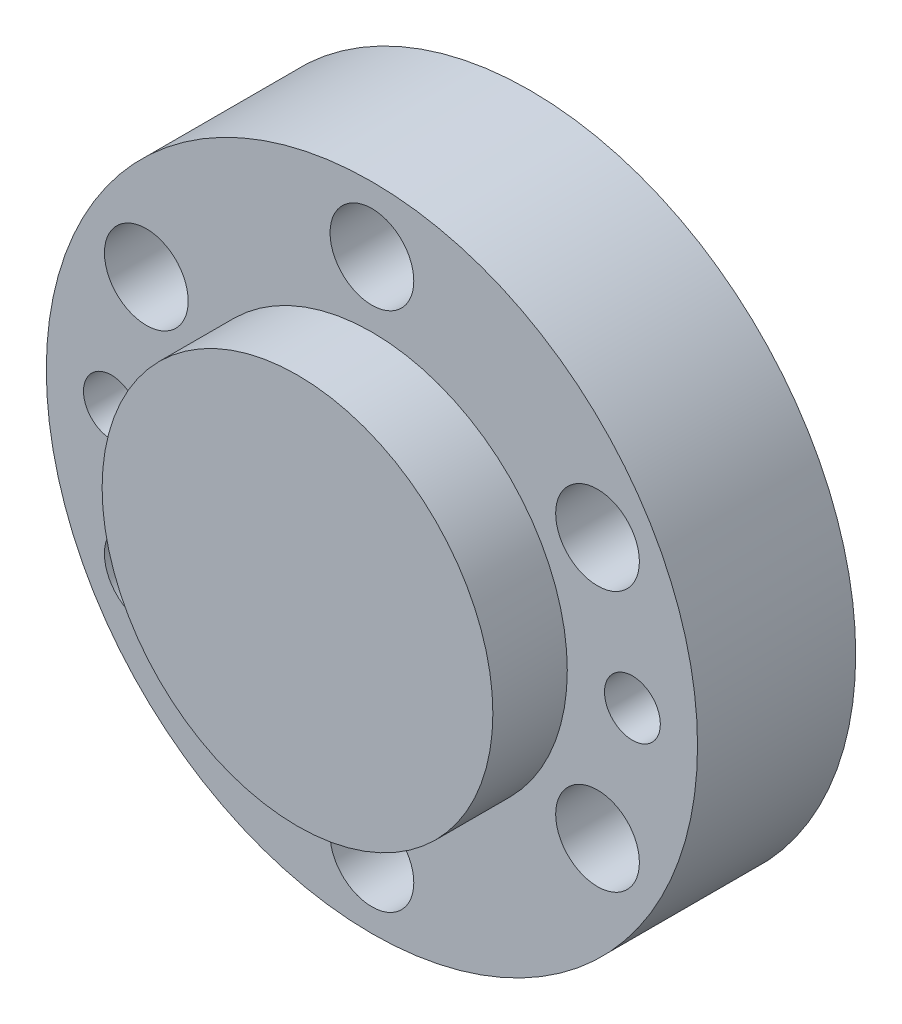
ISO-10303-21;
HEADER;
FILE_DESCRIPTION(('STEP AP214'),'2;1');
FILE_NAME('part.step','',(''),(''),'','','');
FILE_SCHEMA(('AUTOMOTIVE_DESIGN { 1 0 10303 214 1 1 1 1 }'));
ENDSEC;
DATA;
#1=APPLICATION_CONTEXT('core data for automotive mechanical design processes');
#2=APPLICATION_PROTOCOL_DEFINITION('international standard','automotive_design',2000,#1);
#3=PRODUCT_CONTEXT('',#1,'mechanical');
#4=PRODUCT('Part','Part','',(#3));
#5=PRODUCT_RELATED_PRODUCT_CATEGORY('part','',(#4));
#6=PRODUCT_DEFINITION_FORMATION('','',#4);
#7=PRODUCT_DEFINITION_CONTEXT('part definition',#1,'design');
#8=PRODUCT_DEFINITION('design','',#6,#7);
#9=PRODUCT_DEFINITION_SHAPE('','',#8);
#10=(LENGTH_UNIT() NAMED_UNIT(*) SI_UNIT(.MILLI.,.METRE.));
#11=(NAMED_UNIT(*) PLANE_ANGLE_UNIT() SI_UNIT($,.RADIAN.));
#12=(NAMED_UNIT(*) SI_UNIT($,.STERADIAN.) SOLID_ANGLE_UNIT());
#13=UNCERTAINTY_MEASURE_WITH_UNIT(LENGTH_MEASURE(1.E-05),#10,'distance_accuracy_value','');
#14=(GEOMETRIC_REPRESENTATION_CONTEXT(3) GLOBAL_UNCERTAINTY_ASSIGNED_CONTEXT((#13)) GLOBAL_UNIT_ASSIGNED_CONTEXT((#10,
#11,#12)) REPRESENTATION_CONTEXT('',''));
#15=CARTESIAN_POINT('',(0.,0.,0.));
#16=DIRECTION('',(0.,0.,1.));
#17=DIRECTION('',(1.,0.,0.));
#18=AXIS2_PLACEMENT_3D('',#15,#16,#17);
#19=CARTESIAN_POINT('',(0.,0.,-8.5));
#20=DIRECTION('',(0.,0.,-1.));
#21=DIRECTION('',(-1.,0.,0.));
#22=AXIS2_PLACEMENT_3D('',#19,#20,#21);
#23=PLANE('',#22);
#24=CARTESIAN_POINT('',(12.1243556529818,6.99999999999949,-8.5));
#25=DIRECTION('',(0.,0.,-1.));
#26=DIRECTION('',(-1.,0.,0.));
#27=AXIS2_PLACEMENT_3D('',#24,#25,#26);
#28=CIRCLE('',#27,2.25);
#29=CARTESIAN_POINT('',(9.87435565298185,6.99999999999949,-8.5));
#30=VERTEX_POINT('',#29);
#31=EDGE_CURVE('E65',#30,#30,#28,.T.);
#32=ORIENTED_EDGE('',*,*,#31,.F.);
#33=EDGE_LOOP('',(#32));
#34=FACE_BOUND('',#33,.T.);
#35=CARTESIAN_POINT('',(12.1243556529812,-7.00000000000052,-8.5));
#36=DIRECTION('',(0.,0.,-1.));
#37=DIRECTION('',(-1.,0.,0.));
#38=AXIS2_PLACEMENT_3D('',#35,#36,#37);
#39=CIRCLE('',#38,2.25);
#40=CARTESIAN_POINT('',(9.87435565298125,-7.00000000000052,-8.5));
#41=VERTEX_POINT('',#40);
#42=EDGE_CURVE('E70',#41,#41,#39,.T.);
#43=ORIENTED_EDGE('',*,*,#42,.F.);
#44=EDGE_LOOP('',(#43));
#45=FACE_BOUND('',#44,.T.);
#46=CARTESIAN_POINT('',(-1.18856827952055E-12,-14.,-8.5));
#47=DIRECTION('',(0.,0.,-1.));
#48=DIRECTION('',(-1.,0.,0.));
#49=AXIS2_PLACEMENT_3D('',#46,#47,#48);
#50=CIRCLE('',#49,2.25);
#51=CARTESIAN_POINT('',(-2.25000000000119,-14.,-8.5));
#52=VERTEX_POINT('',#51);
#53=EDGE_CURVE('E75',#52,#52,#50,.T.);
#54=ORIENTED_EDGE('',*,*,#53,.F.);
#55=EDGE_LOOP('',(#54));
#56=FACE_BOUND('',#55,.T.);
#57=CARTESIAN_POINT('',(-12.124355652983,-6.99999999999948,-8.5));
#58=DIRECTION('',(0.,0.,-1.));
#59=DIRECTION('',(-1.,0.,0.));
#60=AXIS2_PLACEMENT_3D('',#57,#58,#59);
#61=CIRCLE('',#60,2.25);
#62=CARTESIAN_POINT('',(-14.374355652983,-6.99999999999948,-8.5));
#63=VERTEX_POINT('',#62);
#64=EDGE_CURVE('E80',#63,#63,#61,.T.);
#65=ORIENTED_EDGE('',*,*,#64,.F.);
#66=EDGE_LOOP('',(#65));
#67=FACE_BOUND('',#66,.T.);
#68=CARTESIAN_POINT('',(-12.1243556529824,7.00000000000052,-8.5));
#69=DIRECTION('',(0.,0.,-1.));
#70=DIRECTION('',(-1.,0.,0.));
#71=AXIS2_PLACEMENT_3D('',#68,#69,#70);
#72=CIRCLE('',#71,2.25);
#73=CARTESIAN_POINT('',(-14.3743556529824,7.00000000000052,-8.5));
#74=VERTEX_POINT('',#73);
#75=EDGE_CURVE('E84',#74,#74,#72,.T.);
#76=ORIENTED_EDGE('',*,*,#75,.F.);
#77=EDGE_LOOP('',(#76));
#78=FACE_BOUND('',#77,.T.);
#79=CARTESIAN_POINT('',(0.,14.,-8.5));
#80=DIRECTION('',(0.,0.,-1.));
#81=DIRECTION('',(-1.,0.,0.));
#82=AXIS2_PLACEMENT_3D('',#79,#80,#81);
#83=CIRCLE('',#82,2.25);
#84=CARTESIAN_POINT('',(-2.25,14.,-8.5));
#85=VERTEX_POINT('',#84);
#86=EDGE_CURVE('E88',#85,#85,#83,.T.);
#87=ORIENTED_EDGE('',*,*,#86,.F.);
#88=EDGE_LOOP('',(#87));
#89=FACE_BOUND('',#88,.T.);
#90=CARTESIAN_POINT('',(-14.,0.,-8.5));
#91=DIRECTION('',(0.,0.,-1.));
#92=DIRECTION('',(-1.,0.,0.));
#93=AXIS2_PLACEMENT_3D('',#90,#91,#92);
#94=CIRCLE('',#93,1.5);
#95=CARTESIAN_POINT('',(-15.5,0.,-8.5));
#96=VERTEX_POINT('',#95);
#97=EDGE_CURVE('E102',#96,#96,#94,.T.);
#98=ORIENTED_EDGE('',*,*,#97,.F.);
#99=EDGE_LOOP('',(#98));
#100=FACE_BOUND('',#99,.T.);
#101=CARTESIAN_POINT('',(14.,0.,-8.5));
#102=DIRECTION('',(0.,0.,-1.));
#103=DIRECTION('',(-1.,0.,0.));
#104=AXIS2_PLACEMENT_3D('',#101,#102,#103);
#105=CIRCLE('',#104,1.5);
#106=CARTESIAN_POINT('',(12.5,0.,-8.5));
#107=VERTEX_POINT('',#106);
#108=EDGE_CURVE('E138',#107,#107,#105,.T.);
#109=ORIENTED_EDGE('',*,*,#108,.F.);
#110=EDGE_LOOP('',(#109));
#111=FACE_BOUND('',#110,.T.);
#112=CARTESIAN_POINT('',(0.,0.,-8.5));
#113=DIRECTION('',(0.,0.,1.));
#114=DIRECTION('',(1.,0.,0.));
#115=AXIS2_PLACEMENT_3D('',#112,#113,#114);
#116=CIRCLE('',#115,17.5);
#117=CARTESIAN_POINT('',(17.5,0.,-8.5));
#118=VERTEX_POINT('',#117);
#119=EDGE_CURVE('E141',#118,#118,#116,.T.);
#120=ORIENTED_EDGE('',*,*,#119,.F.);
#121=EDGE_LOOP('',(#120));
#122=FACE_BOUND('',#121,.T.);
#123=ADVANCED_FACE('F44',(#34,#45,#56,#67,#78,#89,#100,#111,#122),#23,.T.);
#124=CARTESIAN_POINT('',(19.,0.,0.));
#125=DIRECTION('',(0.,0.,1.));
#126=DIRECTION('',(1.,0.,0.));
#127=AXIS2_PLACEMENT_3D('',#124,#125,#126);
#128=PLANE('',#127);
#129=CARTESIAN_POINT('',(0.,0.,0.));
#130=DIRECTION('',(0.,0.,1.));
#131=DIRECTION('',(1.,0.,0.));
#132=AXIS2_PLACEMENT_3D('',#129,#130,#131);
#133=CIRCLE('',#132,10.5);
#134=CARTESIAN_POINT('',(10.5,0.,0.));
#135=VERTEX_POINT('',#134);
#136=EDGE_CURVE('E10',#135,#135,#133,.T.);
#137=ORIENTED_EDGE('',*,*,#136,.F.);
#138=EDGE_LOOP('',(#137));
#139=FACE_BOUND('',#138,.T.);
#140=CARTESIAN_POINT('',(12.1243556529818,6.99999999999949,0.));
#141=DIRECTION('',(0.,0.,1.));
#142=DIRECTION('',(1.,0.,0.));
#143=AXIS2_PLACEMENT_3D('',#140,#141,#142);
#144=CIRCLE('',#143,2.25);
#145=CARTESIAN_POINT('',(14.3743556529818,6.99999999999949,0.));
#146=VERTEX_POINT('',#145);
#147=EDGE_CURVE('E58',#146,#146,#144,.T.);
#148=ORIENTED_EDGE('',*,*,#147,.F.);
#149=EDGE_LOOP('',(#148));
#150=FACE_BOUND('',#149,.T.);
#151=CARTESIAN_POINT('',(12.1243556529812,-7.00000000000052,0.));
#152=DIRECTION('',(0.,0.,1.));
#153=DIRECTION('',(1.,0.,0.));
#154=AXIS2_PLACEMENT_3D('',#151,#152,#153);
#155=CIRCLE('',#154,2.25);
#156=CARTESIAN_POINT('',(14.3743556529812,-7.00000000000052,0.));
#157=VERTEX_POINT('',#156);
#158=EDGE_CURVE('E66',#157,#157,#155,.T.);
#159=ORIENTED_EDGE('',*,*,#158,.F.);
#160=EDGE_LOOP('',(#159));
#161=FACE_BOUND('',#160,.T.);
#162=CARTESIAN_POINT('',(-1.18856827952055E-12,-14.,0.));
#163=DIRECTION('',(0.,0.,1.));
#164=DIRECTION('',(1.,0.,0.));
#165=AXIS2_PLACEMENT_3D('',#162,#163,#164);
#166=CIRCLE('',#165,2.25);
#167=CARTESIAN_POINT('',(2.24999999999881,-14.,0.));
#168=VERTEX_POINT('',#167);
#169=EDGE_CURVE('E71',#168,#168,#166,.T.);
#170=ORIENTED_EDGE('',*,*,#169,.F.);
#171=EDGE_LOOP('',(#170));
#172=FACE_BOUND('',#171,.T.);
#173=CARTESIAN_POINT('',(-12.124355652983,-6.99999999999948,0.));
#174=DIRECTION('',(0.,0.,1.));
#175=DIRECTION('',(1.,0.,0.));
#176=AXIS2_PLACEMENT_3D('',#173,#174,#175);
#177=CIRCLE('',#176,2.25);
#178=CARTESIAN_POINT('',(-9.87435565298304,-6.99999999999948,0.));
#179=VERTEX_POINT('',#178);
#180=EDGE_CURVE('E76',#179,#179,#177,.T.);
#181=ORIENTED_EDGE('',*,*,#180,.F.);
#182=EDGE_LOOP('',(#181));
#183=FACE_BOUND('',#182,.T.);
#184=CARTESIAN_POINT('',(-12.1243556529824,7.00000000000052,0.));
#185=DIRECTION('',(0.,0.,1.));
#186=DIRECTION('',(1.,0.,0.));
#187=AXIS2_PLACEMENT_3D('',#184,#185,#186);
#188=CIRCLE('',#187,2.25);
#189=CARTESIAN_POINT('',(-9.87435565298244,7.00000000000052,0.));
#190=VERTEX_POINT('',#189);
#191=EDGE_CURVE('E81',#190,#190,#188,.T.);
#192=ORIENTED_EDGE('',*,*,#191,.F.);
#193=EDGE_LOOP('',(#192));
#194=FACE_BOUND('',#193,.T.);
#195=CARTESIAN_POINT('',(0.,14.,0.));
#196=DIRECTION('',(0.,0.,1.));
#197=DIRECTION('',(1.,0.,0.));
#198=AXIS2_PLACEMENT_3D('',#195,#196,#197);
#199=CIRCLE('',#198,2.25);
#200=CARTESIAN_POINT('',(2.25,14.,0.));
#201=VERTEX_POINT('',#200);
#202=EDGE_CURVE('E85',#201,#201,#199,.T.);
#203=ORIENTED_EDGE('',*,*,#202,.F.);
#204=EDGE_LOOP('',(#203));
#205=FACE_BOUND('',#204,.T.);
#206=CARTESIAN_POINT('',(-14.,0.,0.));
#207=DIRECTION('',(0.,0.,1.));
#208=DIRECTION('',(1.,0.,0.));
#209=AXIS2_PLACEMENT_3D('',#206,#207,#208);
#210=CIRCLE('',#209,1.5);
#211=CARTESIAN_POINT('',(-12.5,0.,0.));
#212=VERTEX_POINT('',#211);
#213=EDGE_CURVE('E96',#212,#212,#210,.T.);
#214=ORIENTED_EDGE('',*,*,#213,.F.);
#215=EDGE_LOOP('',(#214));
#216=FACE_BOUND('',#215,.T.);
#217=CARTESIAN_POINT('',(14.,0.,0.));
#218=DIRECTION('',(0.,0.,1.));
#219=DIRECTION('',(1.,0.,0.));
#220=AXIS2_PLACEMENT_3D('',#217,#218,#219);
#221=CIRCLE('',#220,1.5);
#222=CARTESIAN_POINT('',(15.5,0.,0.));
#223=VERTEX_POINT('',#222);
#224=EDGE_CURVE('E47',#223,#223,#221,.T.);
#225=ORIENTED_EDGE('',*,*,#224,.F.);
#226=EDGE_LOOP('',(#225));
#227=FACE_BOUND('',#226,.T.);
#228=CARTESIAN_POINT('',(0.,0.,0.));
#229=DIRECTION('',(0.,0.,1.));
#230=DIRECTION('',(1.,0.,0.));
#231=AXIS2_PLACEMENT_3D('',#228,#229,#230);
#232=CIRCLE('',#231,17.5);
#233=CARTESIAN_POINT('',(17.5,0.,0.));
#234=VERTEX_POINT('',#233);
#235=EDGE_CURVE('E144',#234,#234,#232,.T.);
#236=ORIENTED_EDGE('',*,*,#235,.T.);
#237=EDGE_LOOP('',(#236));
#238=FACE_BOUND('',#237,.T.);
#239=ADVANCED_FACE('F122',(#139,#150,#161,#172,#183,#194,#205,#216,#227,#238),#128,.T.);
#240=CARTESIAN_POINT('',(0.,0.,4.));
#241=DIRECTION('',(0.,0.,1.));
#242=DIRECTION('',(1.,0.,0.));
#243=AXIS2_PLACEMENT_3D('',#240,#241,#242);
#244=CYLINDRICAL_SURFACE('',#243,10.5);
#245=ORIENTED_EDGE('',*,*,#136,.T.);
#246=EDGE_LOOP('',(#245));
#247=FACE_BOUND('',#246,.T.);
#248=CARTESIAN_POINT('',(0.,0.,4.));
#249=DIRECTION('',(0.,0.,1.));
#250=DIRECTION('',(1.,0.,0.));
#251=AXIS2_PLACEMENT_3D('',#248,#249,#250);
#252=CIRCLE('',#251,10.5);
#253=CARTESIAN_POINT('',(10.5,0.,4.));
#254=VERTEX_POINT('',#253);
#255=EDGE_CURVE('E52',#254,#254,#252,.T.);
#256=ORIENTED_EDGE('',*,*,#255,.F.);
#257=EDGE_LOOP('',(#256));
#258=FACE_BOUND('',#257,.T.);
#259=ADVANCED_FACE('F162',(#247,#258),#244,.T.);
#260=CARTESIAN_POINT('',(10.5,0.,4.));
#261=DIRECTION('',(0.,0.,1.));
#262=DIRECTION('',(1.,0.,0.));
#263=AXIS2_PLACEMENT_3D('',#260,#261,#262);
#264=PLANE('',#263);
#265=ORIENTED_EDGE('',*,*,#255,.T.);
#266=EDGE_LOOP('',(#265));
#267=FACE_BOUND('',#266,.T.);
#268=ADVANCED_FACE('F177',(#267),#264,.T.);
#269=CARTESIAN_POINT('',(12.1243556529818,6.99999999999949,-8.5));
#270=DIRECTION('',(0.,0.,-1.));
#271=DIRECTION('',(-1.,0.,0.));
#272=AXIS2_PLACEMENT_3D('',#269,#270,#271);
#273=CYLINDRICAL_SURFACE('',#272,2.25);
#274=ORIENTED_EDGE('',*,*,#147,.T.);
#275=EDGE_LOOP('',(#274));
#276=FACE_BOUND('',#275,.T.);
#277=ORIENTED_EDGE('',*,*,#31,.T.);
#278=EDGE_LOOP('',(#277));
#279=FACE_BOUND('',#278,.T.);
#280=ADVANCED_FACE('F118',(#276,#279),#273,.F.);
#281=CARTESIAN_POINT('',(12.1243556529812,-7.00000000000052,-8.5));
#282=DIRECTION('',(0.,0.,-1.));
#283=DIRECTION('',(-1.,0.,0.));
#284=AXIS2_PLACEMENT_3D('',#281,#282,#283);
#285=CYLINDRICAL_SURFACE('',#284,2.25);
#286=ORIENTED_EDGE('',*,*,#158,.T.);
#287=EDGE_LOOP('',(#286));
#288=FACE_BOUND('',#287,.T.);
#289=ORIENTED_EDGE('',*,*,#42,.T.);
#290=EDGE_LOOP('',(#289));
#291=FACE_BOUND('',#290,.T.);
#292=ADVANCED_FACE('F183',(#288,#291),#285,.F.);
#293=CARTESIAN_POINT('',(-1.18856827952055E-12,-14.,-8.5));
#294=DIRECTION('',(0.,0.,-1.));
#295=DIRECTION('',(-1.,0.,0.));
#296=AXIS2_PLACEMENT_3D('',#293,#294,#295);
#297=CYLINDRICAL_SURFACE('',#296,2.25);
#298=ORIENTED_EDGE('',*,*,#169,.T.);
#299=EDGE_LOOP('',(#298));
#300=FACE_BOUND('',#299,.T.);
#301=ORIENTED_EDGE('',*,*,#53,.T.);
#302=EDGE_LOOP('',(#301));
#303=FACE_BOUND('',#302,.T.);
#304=ADVANCED_FACE('F187',(#300,#303),#297,.F.);
#305=CARTESIAN_POINT('',(-12.124355652983,-6.99999999999948,-8.5));
#306=DIRECTION('',(0.,0.,-1.));
#307=DIRECTION('',(-1.,0.,0.));
#308=AXIS2_PLACEMENT_3D('',#305,#306,#307);
#309=CYLINDRICAL_SURFACE('',#308,2.25);
#310=ORIENTED_EDGE('',*,*,#180,.T.);
#311=EDGE_LOOP('',(#310));
#312=FACE_BOUND('',#311,.T.);
#313=ORIENTED_EDGE('',*,*,#64,.T.);
#314=EDGE_LOOP('',(#313));
#315=FACE_BOUND('',#314,.T.);
#316=ADVANCED_FACE('F191',(#312,#315),#309,.F.);
#317=CARTESIAN_POINT('',(-12.1243556529824,7.00000000000052,-8.5));
#318=DIRECTION('',(0.,0.,-1.));
#319=DIRECTION('',(-1.,0.,0.));
#320=AXIS2_PLACEMENT_3D('',#317,#318,#319);
#321=CYLINDRICAL_SURFACE('',#320,2.25);
#322=ORIENTED_EDGE('',*,*,#191,.T.);
#323=EDGE_LOOP('',(#322));
#324=FACE_BOUND('',#323,.T.);
#325=ORIENTED_EDGE('',*,*,#75,.T.);
#326=EDGE_LOOP('',(#325));
#327=FACE_BOUND('',#326,.T.);
#328=ADVANCED_FACE('F195',(#324,#327),#321,.F.);
#329=CARTESIAN_POINT('',(0.,14.,-8.5));
#330=DIRECTION('',(0.,0.,-1.));
#331=DIRECTION('',(-1.,0.,0.));
#332=AXIS2_PLACEMENT_3D('',#329,#330,#331);
#333=CYLINDRICAL_SURFACE('',#332,2.25);
#334=ORIENTED_EDGE('',*,*,#202,.T.);
#335=EDGE_LOOP('',(#334));
#336=FACE_BOUND('',#335,.T.);
#337=ORIENTED_EDGE('',*,*,#86,.T.);
#338=EDGE_LOOP('',(#337));
#339=FACE_BOUND('',#338,.T.);
#340=ADVANCED_FACE('F199',(#336,#339),#333,.F.);
#341=CARTESIAN_POINT('',(-14.,0.,-8.5));
#342=DIRECTION('',(0.,0.,-1.));
#343=DIRECTION('',(-1.,0.,0.));
#344=AXIS2_PLACEMENT_3D('',#341,#342,#343);
#345=CYLINDRICAL_SURFACE('',#344,1.5);
#346=ORIENTED_EDGE('',*,*,#213,.T.);
#347=EDGE_LOOP('',(#346));
#348=FACE_BOUND('',#347,.T.);
#349=ORIENTED_EDGE('',*,*,#97,.T.);
#350=EDGE_LOOP('',(#349));
#351=FACE_BOUND('',#350,.T.);
#352=ADVANCED_FACE('F172',(#348,#351),#345,.F.);
#353=CARTESIAN_POINT('',(14.,0.,-8.5));
#354=DIRECTION('',(0.,0.,-1.));
#355=DIRECTION('',(-1.,0.,0.));
#356=AXIS2_PLACEMENT_3D('',#353,#354,#355);
#357=CYLINDRICAL_SURFACE('',#356,1.5);
#358=ORIENTED_EDGE('',*,*,#224,.T.);
#359=EDGE_LOOP('',(#358));
#360=FACE_BOUND('',#359,.T.);
#361=ORIENTED_EDGE('',*,*,#108,.T.);
#362=EDGE_LOOP('',(#361));
#363=FACE_BOUND('',#362,.T.);
#364=ADVANCED_FACE('F157',(#360,#363),#357,.F.);
#365=CARTESIAN_POINT('',(0.,0.,4.));
#366=DIRECTION('',(0.,0.,1.));
#367=DIRECTION('',(1.,0.,0.));
#368=AXIS2_PLACEMENT_3D('',#365,#366,#367);
#369=CYLINDRICAL_SURFACE('',#368,17.5);
#370=ORIENTED_EDGE('',*,*,#235,.F.);
#371=EDGE_LOOP('',(#370));
#372=FACE_BOUND('',#371,.T.);
#373=ORIENTED_EDGE('',*,*,#119,.T.);
#374=EDGE_LOOP('',(#373));
#375=FACE_BOUND('',#374,.T.);
#376=ADVANCED_FACE('F167',(#372,#375),#369,.T.);
#377=CLOSED_SHELL('',(#123,#239,#259,#268,#280,#292,#304,#316,#328,#340,#352,#364,#376));
#378=MANIFOLD_SOLID_BREP('B2',#377);
#379=ADVANCED_BREP_SHAPE_REPRESENTATION('',(#18,#378),#14);
#380=SHAPE_DEFINITION_REPRESENTATION(#9,#379);
ENDSEC;
END-ISO-10303-21;
